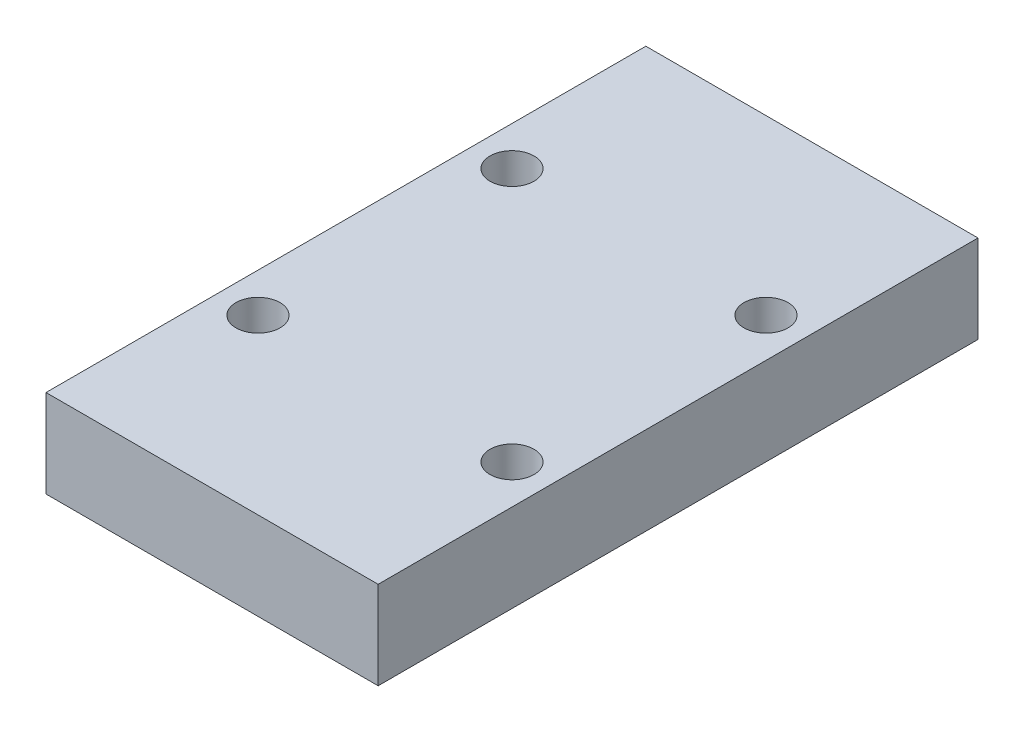
ISO-10303-21;
HEADER;
FILE_DESCRIPTION(('STEP AP214'),'2;1');
FILE_NAME('part.step','',(''),(''),'','','');
FILE_SCHEMA(('AUTOMOTIVE_DESIGN { 1 0 10303 214 1 1 1 1 }'));
ENDSEC;
DATA;
#1=APPLICATION_CONTEXT('core data for automotive mechanical design processes');
#2=APPLICATION_PROTOCOL_DEFINITION('international standard','automotive_design',2000,#1);
#3=PRODUCT_CONTEXT('',#1,'mechanical');
#4=PRODUCT('Part','Part','',(#3));
#5=PRODUCT_RELATED_PRODUCT_CATEGORY('part','',(#4));
#6=PRODUCT_DEFINITION_FORMATION('','',#4);
#7=PRODUCT_DEFINITION_CONTEXT('part definition',#1,'design');
#8=PRODUCT_DEFINITION('design','',#6,#7);
#9=PRODUCT_DEFINITION_SHAPE('','',#8);
#10=(LENGTH_UNIT() NAMED_UNIT(*) SI_UNIT(.MILLI.,.METRE.));
#11=(NAMED_UNIT(*) PLANE_ANGLE_UNIT() SI_UNIT($,.RADIAN.));
#12=(NAMED_UNIT(*) SI_UNIT($,.STERADIAN.) SOLID_ANGLE_UNIT());
#13=UNCERTAINTY_MEASURE_WITH_UNIT(LENGTH_MEASURE(1.E-05),#10,'distance_accuracy_value','');
#14=(GEOMETRIC_REPRESENTATION_CONTEXT(3) GLOBAL_UNCERTAINTY_ASSIGNED_CONTEXT((#13)) GLOBAL_UNIT_ASSIGNED_CONTEXT((#10,
#11,#12)) REPRESENTATION_CONTEXT('',''));
#15=CARTESIAN_POINT('',(0.,0.,0.));
#16=DIRECTION('',(0.,0.,1.));
#17=DIRECTION('',(1.,0.,0.));
#18=AXIS2_PLACEMENT_3D('',#15,#16,#17);
#19=CARTESIAN_POINT('',(0.,9.0016,0.));
#20=DIRECTION('',(0.,-1.,0.));
#21=DIRECTION('',(0.,0.,-1.));
#22=AXIS2_PLACEMENT_3D('',#19,#20,#21);
#23=PLANE('',#22);
#24=CARTESIAN_POINT('',(30.,9.0016,43.7));
#25=DIRECTION('',(0.,-1.,0.));
#26=DIRECTION('',(0.,0.,-1.));
#27=AXIS2_PLACEMENT_3D('',#24,#25,#26);
#28=CIRCLE('',#27,2.25);
#29=CARTESIAN_POINT('',(30.,9.0016,41.45));
#30=VERTEX_POINT('',#29);
#31=EDGE_CURVE('E90',#30,#30,#28,.T.);
#32=ORIENTED_EDGE('',*,*,#31,.T.);
#33=EDGE_LOOP('',(#32));
#34=FACE_BOUND('',#33,.T.);
#35=CARTESIAN_POINT('',(4.,9.0016,43.7));
#36=DIRECTION('',(0.,-1.,0.));
#37=DIRECTION('',(0.,0.,-1.));
#38=AXIS2_PLACEMENT_3D('',#35,#36,#37);
#39=CIRCLE('',#38,2.25);
#40=CARTESIAN_POINT('',(4.,9.0016,41.45));
#41=VERTEX_POINT('',#40);
#42=EDGE_CURVE('E94',#41,#41,#39,.T.);
#43=ORIENTED_EDGE('',*,*,#42,.T.);
#44=EDGE_LOOP('',(#43));
#45=FACE_BOUND('',#44,.T.);
#46=CARTESIAN_POINT('',(30.,9.0016,17.7));
#47=DIRECTION('',(0.,-1.,0.));
#48=DIRECTION('',(0.,0.,-1.));
#49=AXIS2_PLACEMENT_3D('',#46,#47,#48);
#50=CIRCLE('',#49,2.25);
#51=CARTESIAN_POINT('',(30.,9.0016,15.45));
#52=VERTEX_POINT('',#51);
#53=EDGE_CURVE('E96',#52,#52,#50,.T.);
#54=ORIENTED_EDGE('',*,*,#53,.T.);
#55=EDGE_LOOP('',(#54));
#56=FACE_BOUND('',#55,.T.);
#57=CARTESIAN_POINT('',(4.,9.0016,17.7));
#58=DIRECTION('',(0.,-1.,0.));
#59=DIRECTION('',(0.,0.,-1.));
#60=AXIS2_PLACEMENT_3D('',#57,#58,#59);
#61=CIRCLE('',#60,2.25);
#62=CARTESIAN_POINT('',(4.,9.0016,15.45));
#63=VERTEX_POINT('',#62);
#64=EDGE_CURVE('E19',#63,#63,#61,.T.);
#65=ORIENTED_EDGE('',*,*,#64,.T.);
#66=EDGE_LOOP('',(#65));
#67=FACE_BOUND('',#66,.T.);
#68=DIRECTION('',(0.,0.,-1.));
#69=VECTOR('',#68,1.);
#70=CARTESIAN_POINT('',(34.,9.0016,0.));
#71=LINE('',#70,#69);
#72=CARTESIAN_POINT('',(34.,9.0016,0.));
#73=VERTEX_POINT('',#72);
#74=CARTESIAN_POINT('',(34.,9.0016,61.4));
#75=VERTEX_POINT('',#74);
#76=EDGE_CURVE('E61',#73,#75,#71,.F.);
#77=ORIENTED_EDGE('',*,*,#76,.F.);
#78=DIRECTION('',(1.,0.,0.));
#79=VECTOR('',#78,1.);
#80=CARTESIAN_POINT('',(0.,9.0016,0.));
#81=LINE('',#80,#79);
#82=CARTESIAN_POINT('',(0.,9.0016,0.));
#83=VERTEX_POINT('',#82);
#84=EDGE_CURVE('E55',#73,#83,#81,.F.);
#85=ORIENTED_EDGE('',*,*,#84,.T.);
#86=DIRECTION('',(0.,0.,-1.));
#87=VECTOR('',#86,1.);
#88=CARTESIAN_POINT('',(0.,9.0016,0.));
#89=LINE('',#88,#87);
#90=CARTESIAN_POINT('',(0.,9.0016,61.4));
#91=VERTEX_POINT('',#90);
#92=EDGE_CURVE('E59',#83,#91,#89,.F.);
#93=ORIENTED_EDGE('',*,*,#92,.T.);
#94=DIRECTION('',(1.,0.,0.));
#95=VECTOR('',#94,1.);
#96=CARTESIAN_POINT('',(0.,9.0016,61.4));
#97=LINE('',#96,#95);
#98=EDGE_CURVE('E105',#75,#91,#97,.F.);
#99=ORIENTED_EDGE('',*,*,#98,.F.);
#100=EDGE_LOOP('',(#77,#85,#93,#99));
#101=FACE_BOUND('',#100,.T.);
#102=ADVANCED_FACE('F16',(#34,#45,#56,#67,#101),#23,.F.);
#103=CARTESIAN_POINT('',(0.,9.0016,0.));
#104=DIRECTION('',(1.,0.,0.));
#105=DIRECTION('',(0.,0.,-1.));
#106=AXIS2_PLACEMENT_3D('',#103,#104,#105);
#107=PLANE('',#106);
#108=DIRECTION('',(0.,1.,0.));
#109=VECTOR('',#108,1.);
#110=CARTESIAN_POINT('',(0.,9.0016,61.4));
#111=LINE('',#110,#109);
#112=CARTESIAN_POINT('',(0.,0.00160000000001003,61.4));
#113=VERTEX_POINT('',#112);
#114=EDGE_CURVE('E69',#91,#113,#111,.F.);
#115=ORIENTED_EDGE('',*,*,#114,.F.);
#116=ORIENTED_EDGE('',*,*,#92,.F.);
#117=DIRECTION('',(0.,1.,0.));
#118=VECTOR('',#117,1.);
#119=CARTESIAN_POINT('',(0.,9.0016,0.));
#120=LINE('',#119,#118);
#121=CARTESIAN_POINT('',(0.,0.00160000000001003,0.));
#122=VERTEX_POINT('',#121);
#123=EDGE_CURVE('E63',#83,#122,#120,.F.);
#124=ORIENTED_EDGE('',*,*,#123,.T.);
#125=DIRECTION('',(0.,0.,-1.));
#126=VECTOR('',#125,1.);
#127=CARTESIAN_POINT('',(0.,0.001600000000053,0.));
#128=LINE('',#127,#126);
#129=EDGE_CURVE('E93',#113,#122,#128,.T.);
#130=ORIENTED_EDGE('',*,*,#129,.F.);
#131=EDGE_LOOP('',(#115,#116,#124,#130));
#132=FACE_BOUND('',#131,.T.);
#133=ADVANCED_FACE('F66',(#132),#107,.F.);
#134=CARTESIAN_POINT('',(0.,9.0016,0.));
#135=DIRECTION('',(0.,0.,1.));
#136=DIRECTION('',(1.,0.,0.));
#137=AXIS2_PLACEMENT_3D('',#134,#135,#136);
#138=PLANE('',#137);
#139=DIRECTION('',(1.,0.,0.));
#140=VECTOR('',#139,1.);
#141=CARTESIAN_POINT('',(0.,0.001600000000053,0.));
#142=LINE('',#141,#140);
#143=CARTESIAN_POINT('',(34.,0.00160000000001003,0.));
#144=VERTEX_POINT('',#143);
#145=EDGE_CURVE('E74',#122,#144,#142,.T.);
#146=ORIENTED_EDGE('',*,*,#145,.F.);
#147=ORIENTED_EDGE('',*,*,#123,.F.);
#148=ORIENTED_EDGE('',*,*,#84,.F.);
#149=DIRECTION('',(0.,1.,0.));
#150=VECTOR('',#149,1.);
#151=CARTESIAN_POINT('',(34.,9.0016,0.));
#152=LINE('',#151,#150);
#153=EDGE_CURVE('E76',#144,#73,#152,.T.);
#154=ORIENTED_EDGE('',*,*,#153,.F.);
#155=EDGE_LOOP('',(#146,#147,#148,#154));
#156=FACE_BOUND('',#155,.T.);
#157=ADVANCED_FACE('F72',(#156),#138,.F.);
#158=CARTESIAN_POINT('',(34.,9.0016,0.));
#159=DIRECTION('',(1.,0.,0.));
#160=DIRECTION('',(0.,0.,-1.));
#161=AXIS2_PLACEMENT_3D('',#158,#159,#160);
#162=PLANE('',#161);
#163=DIRECTION('',(0.,1.,0.));
#164=VECTOR('',#163,1.);
#165=CARTESIAN_POINT('',(34.,9.0016,61.4));
#166=LINE('',#165,#164);
#167=CARTESIAN_POINT('',(34.,0.00160000000001003,61.4));
#168=VERTEX_POINT('',#167);
#169=EDGE_CURVE('E34',#168,#75,#166,.T.);
#170=ORIENTED_EDGE('',*,*,#169,.F.);
#171=DIRECTION('',(0.,0.,-1.));
#172=VECTOR('',#171,1.);
#173=CARTESIAN_POINT('',(34.,0.001600000000053,0.));
#174=LINE('',#173,#172);
#175=EDGE_CURVE('E112',#144,#168,#174,.F.);
#176=ORIENTED_EDGE('',*,*,#175,.F.);
#177=ORIENTED_EDGE('',*,*,#153,.T.);
#178=ORIENTED_EDGE('',*,*,#76,.T.);
#179=EDGE_LOOP('',(#170,#176,#177,#178));
#180=FACE_BOUND('',#179,.T.);
#181=ADVANCED_FACE('F110',(#180),#162,.T.);
#182=CARTESIAN_POINT('',(0.,9.0016,61.4));
#183=DIRECTION('',(0.,0.,1.));
#184=DIRECTION('',(1.,0.,0.));
#185=AXIS2_PLACEMENT_3D('',#182,#183,#184);
#186=PLANE('',#185);
#187=DIRECTION('',(1.,0.,0.));
#188=VECTOR('',#187,1.);
#189=CARTESIAN_POINT('',(0.,0.001600000000053,61.4));
#190=LINE('',#189,#188);
#191=EDGE_CURVE('E89',#168,#113,#190,.F.);
#192=ORIENTED_EDGE('',*,*,#191,.F.);
#193=ORIENTED_EDGE('',*,*,#169,.T.);
#194=ORIENTED_EDGE('',*,*,#98,.T.);
#195=ORIENTED_EDGE('',*,*,#114,.T.);
#196=EDGE_LOOP('',(#192,#193,#194,#195));
#197=FACE_BOUND('',#196,.T.);
#198=ADVANCED_FACE('F118',(#197),#186,.T.);
#199=CARTESIAN_POINT('',(4.,9.0016,17.7));
#200=DIRECTION('',(0.,-1.,0.));
#201=DIRECTION('',(0.,0.,-1.));
#202=AXIS2_PLACEMENT_3D('',#199,#200,#201);
#203=CYLINDRICAL_SURFACE('',#202,2.25);
#204=ORIENTED_EDGE('',*,*,#64,.F.);
#205=EDGE_LOOP('',(#204));
#206=FACE_BOUND('',#205,.T.);
#207=CARTESIAN_POINT('',(4.,0.0015999999999957,17.7));
#208=DIRECTION('',(0.,-1.,0.));
#209=DIRECTION('',(0.,0.,-1.));
#210=AXIS2_PLACEMENT_3D('',#207,#208,#209);
#211=CIRCLE('',#210,2.25);
#212=CARTESIAN_POINT('',(4.,0.0015999999999957,15.45));
#213=VERTEX_POINT('',#212);
#214=EDGE_CURVE('E86',#213,#213,#211,.F.);
#215=ORIENTED_EDGE('',*,*,#214,.F.);
#216=EDGE_LOOP('',(#215));
#217=FACE_BOUND('',#216,.T.);
#218=ADVANCED_FACE('F120',(#206,#217),#203,.F.);
#219=CARTESIAN_POINT('',(30.,9.0016,17.7));
#220=DIRECTION('',(0.,-1.,0.));
#221=DIRECTION('',(0.,0.,-1.));
#222=AXIS2_PLACEMENT_3D('',#219,#220,#221);
#223=CYLINDRICAL_SURFACE('',#222,2.25);
#224=ORIENTED_EDGE('',*,*,#53,.F.);
#225=EDGE_LOOP('',(#224));
#226=FACE_BOUND('',#225,.T.);
#227=CARTESIAN_POINT('',(30.,0.0015999999999957,17.7));
#228=DIRECTION('',(0.,-1.,0.));
#229=DIRECTION('',(0.,0.,-1.));
#230=AXIS2_PLACEMENT_3D('',#227,#228,#229);
#231=CIRCLE('',#230,2.25);
#232=CARTESIAN_POINT('',(30.,0.0015999999999957,15.45));
#233=VERTEX_POINT('',#232);
#234=EDGE_CURVE('E83',#233,#233,#231,.F.);
#235=ORIENTED_EDGE('',*,*,#234,.F.);
#236=EDGE_LOOP('',(#235));
#237=FACE_BOUND('',#236,.T.);
#238=ADVANCED_FACE('F127',(#226,#237),#223,.F.);
#239=CARTESIAN_POINT('',(4.,9.0016,43.7));
#240=DIRECTION('',(0.,-1.,0.));
#241=DIRECTION('',(0.,0.,-1.));
#242=AXIS2_PLACEMENT_3D('',#239,#240,#241);
#243=CYLINDRICAL_SURFACE('',#242,2.25);
#244=ORIENTED_EDGE('',*,*,#42,.F.);
#245=EDGE_LOOP('',(#244));
#246=FACE_BOUND('',#245,.T.);
#247=CARTESIAN_POINT('',(4.,0.0015999999999957,43.7));
#248=DIRECTION('',(0.,-1.,0.));
#249=DIRECTION('',(0.,0.,-1.));
#250=AXIS2_PLACEMENT_3D('',#247,#248,#249);
#251=CIRCLE('',#250,2.25);
#252=CARTESIAN_POINT('',(4.,0.0015999999999957,41.45));
#253=VERTEX_POINT('',#252);
#254=EDGE_CURVE('E25',#253,#253,#251,.F.);
#255=ORIENTED_EDGE('',*,*,#254,.F.);
#256=EDGE_LOOP('',(#255));
#257=FACE_BOUND('',#256,.T.);
#258=ADVANCED_FACE('F138',(#246,#257),#243,.F.);
#259=CARTESIAN_POINT('',(30.,9.0016,43.7));
#260=DIRECTION('',(0.,-1.,0.));
#261=DIRECTION('',(0.,0.,-1.));
#262=AXIS2_PLACEMENT_3D('',#259,#260,#261);
#263=CYLINDRICAL_SURFACE('',#262,2.25);
#264=ORIENTED_EDGE('',*,*,#31,.F.);
#265=EDGE_LOOP('',(#264));
#266=FACE_BOUND('',#265,.T.);
#267=CARTESIAN_POINT('',(30.,0.0015999999999957,43.7));
#268=DIRECTION('',(0.,-1.,0.));
#269=DIRECTION('',(0.,0.,-1.));
#270=AXIS2_PLACEMENT_3D('',#267,#268,#269);
#271=CIRCLE('',#270,2.25);
#272=CARTESIAN_POINT('',(30.,0.0015999999999957,41.45));
#273=VERTEX_POINT('',#272);
#274=EDGE_CURVE('E11',#273,#273,#271,.F.);
#275=ORIENTED_EDGE('',*,*,#274,.F.);
#276=EDGE_LOOP('',(#275));
#277=FACE_BOUND('',#276,.T.);
#278=ADVANCED_FACE('F132',(#266,#277),#263,.F.);
#279=CARTESIAN_POINT('',(0.,0.001600000000053,0.));
#280=DIRECTION('',(0.,-1.,0.));
#281=DIRECTION('',(0.,0.,-1.));
#282=AXIS2_PLACEMENT_3D('',#279,#280,#281);
#283=PLANE('',#282);
#284=ORIENTED_EDGE('',*,*,#274,.T.);
#285=EDGE_LOOP('',(#284));
#286=FACE_BOUND('',#285,.T.);
#287=ORIENTED_EDGE('',*,*,#254,.T.);
#288=EDGE_LOOP('',(#287));
#289=FACE_BOUND('',#288,.T.);
#290=ORIENTED_EDGE('',*,*,#234,.T.);
#291=EDGE_LOOP('',(#290));
#292=FACE_BOUND('',#291,.T.);
#293=ORIENTED_EDGE('',*,*,#214,.T.);
#294=EDGE_LOOP('',(#293));
#295=FACE_BOUND('',#294,.T.);
#296=ORIENTED_EDGE('',*,*,#175,.T.);
#297=ORIENTED_EDGE('',*,*,#191,.T.);
#298=ORIENTED_EDGE('',*,*,#129,.T.);
#299=ORIENTED_EDGE('',*,*,#145,.T.);
#300=EDGE_LOOP('',(#296,#297,#298,#299));
#301=FACE_BOUND('',#300,.T.);
#302=ADVANCED_FACE('F116',(#286,#289,#292,#295,#301),#283,.T.);
#303=CLOSED_SHELL('',(#102,#133,#157,#181,#198,#218,#238,#258,#278,#302));
#304=MANIFOLD_SOLID_BREP('B1',#303);
#305=ADVANCED_BREP_SHAPE_REPRESENTATION('',(#18,#304),#14);
#306=SHAPE_DEFINITION_REPRESENTATION(#9,#305);
ENDSEC;
END-ISO-10303-21;
